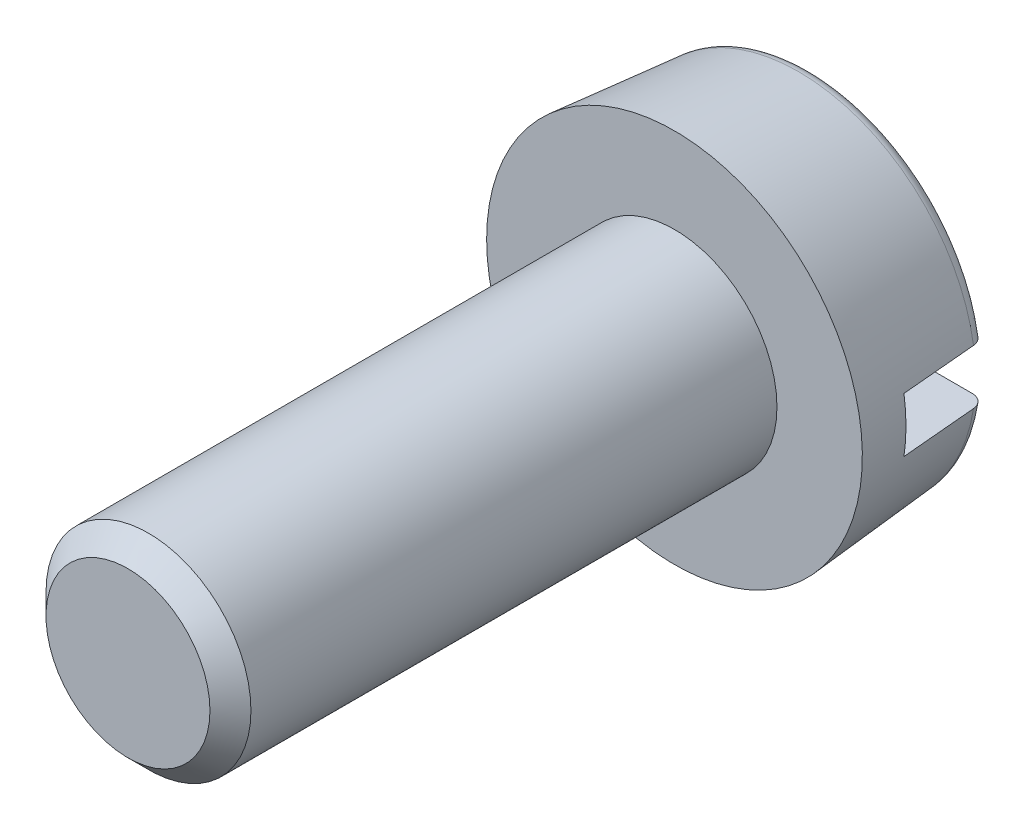
ISO-10303-21;
HEADER;
FILE_DESCRIPTION(('STEP AP214'),'2;1');
FILE_NAME('part.step','',(''),(''),'','','');
FILE_SCHEMA(('AUTOMOTIVE_DESIGN { 1 0 10303 214 1 1 1 1 }'));
ENDSEC;
DATA;
#1=APPLICATION_CONTEXT('core data for automotive mechanical design processes');
#2=APPLICATION_PROTOCOL_DEFINITION('international standard','automotive_design',2000,#1);
#3=PRODUCT_CONTEXT('',#1,'mechanical');
#4=PRODUCT('Part','Part','',(#3));
#5=PRODUCT_RELATED_PRODUCT_CATEGORY('part','',(#4));
#6=PRODUCT_DEFINITION_FORMATION('','',#4);
#7=PRODUCT_DEFINITION_CONTEXT('part definition',#1,'design');
#8=PRODUCT_DEFINITION('design','',#6,#7);
#9=PRODUCT_DEFINITION_SHAPE('','',#8);
#10=(LENGTH_UNIT() NAMED_UNIT(*) SI_UNIT(.MILLI.,.METRE.));
#11=(NAMED_UNIT(*) PLANE_ANGLE_UNIT() SI_UNIT($,.RADIAN.));
#12=(NAMED_UNIT(*) SI_UNIT($,.STERADIAN.) SOLID_ANGLE_UNIT());
#13=UNCERTAINTY_MEASURE_WITH_UNIT(LENGTH_MEASURE(1.E-05),#10,'distance_accuracy_value','');
#14=(GEOMETRIC_REPRESENTATION_CONTEXT(3) GLOBAL_UNCERTAINTY_ASSIGNED_CONTEXT((#13)) GLOBAL_UNIT_ASSIGNED_CONTEXT((#10,
#11,#12)) REPRESENTATION_CONTEXT('',''));
#15=CARTESIAN_POINT('',(0.,0.,0.));
#16=DIRECTION('',(0.,0.,1.));
#17=DIRECTION('',(1.,0.,0.));
#18=AXIS2_PLACEMENT_3D('',#15,#16,#17);
#19=CARTESIAN_POINT('',(0.,0.,-2.));
#20=DIRECTION('',(0.,0.,1.));
#21=DIRECTION('',(1.,0.,0.));
#22=AXIS2_PLACEMENT_3D('',#19,#20,#21);
#23=PLANE('',#22);
#24=DIRECTION('',(1.,0.,0.));
#25=VECTOR('',#24,1.);
#26=CARTESIAN_POINT('',(-2.75000000000005,-0.399999999999965,-2.));
#27=LINE('',#26,#25);
#28=CARTESIAN_POINT('',(-2.35807100389422,-0.399999999999972,-2.));
#29=VERTEX_POINT('',#28);
#30=CARTESIAN_POINT('',(2.35807100389412,-0.39999999999998,-1.99999999999997));
#31=VERTEX_POINT('',#30);
#32=EDGE_CURVE('E206',#29,#31,#27,.T.);
#33=ORIENTED_EDGE('',*,*,#32,.T.);
#34=CARTESIAN_POINT('',(0.,0.,-2.));
#35=DIRECTION('',(0.,0.,-1.));
#36=DIRECTION('',(-1.,0.,0.));
#37=AXIS2_PLACEMENT_3D('',#34,#35,#36);
#38=CIRCLE('',#37,2.39175643814467);
#39=EDGE_CURVE('E116',#31,#29,#38,.T.);
#40=ORIENTED_EDGE('',*,*,#39,.T.);
#41=EDGE_LOOP('',(#33,#40));
#42=FACE_BOUND('',#41,.T.);
#43=ADVANCED_FACE('F36',(#42),#23,.F.);
#44=DIRECTION('',(-1.,0.,0.));
#45=VECTOR('',#44,1.);
#46=CARTESIAN_POINT('',(-2.75,0.400000000000036,-2.));
#47=LINE('',#46,#45);
#48=CARTESIAN_POINT('',(2.35807100389417,0.400000000000018,-1.99999999999997));
#49=VERTEX_POINT('',#48);
#50=CARTESIAN_POINT('',(-2.35807100389417,0.400000000000029,-2.));
#51=VERTEX_POINT('',#50);
#52=EDGE_CURVE('E101',#49,#51,#47,.T.);
#53=ORIENTED_EDGE('',*,*,#52,.T.);
#54=EDGE_CURVE('E113',#51,#49,#38,.T.);
#55=ORIENTED_EDGE('',*,*,#54,.T.);
#56=EDGE_LOOP('',(#53,#55));
#57=FACE_BOUND('',#56,.T.);
#58=ADVANCED_FACE('F147',(#57),#23,.F.);
#59=CARTESIAN_POINT('',(0.,0.,-1.8));
#60=DIRECTION('',(0.,0.,-1.));
#61=DIRECTION('',(-1.,0.,0.));
#62=AXIS2_PLACEMENT_3D('',#59,#60,#61);
#63=TOROIDAL_SURFACE('',#62,2.39175643814467,0.2);
#64=CARTESIAN_POINT('',(-2.4605600417854,-0.399999999999949,-1.62743732282769));
#65=CARTESIAN_POINT('',(-2.47035713771362,-0.40000000000003,-1.6330918956269));
#66=CARTESIAN_POINT('',(-2.47967120968412,-0.400000000000017,-1.63958058222681));
#67=CARTESIAN_POINT('',(-2.49708617580804,-0.399999999999955,-1.65401697585564));
#68=CARTESIAN_POINT('',(-2.5051873842648,-0.399999999999906,-1.66196430369759));
#69=CARTESIAN_POINT('',(-2.51994054140107,-0.399999999999919,-1.67911855993578));
#70=CARTESIAN_POINT('',(-2.52659136348955,-0.399999999999983,-1.68832645851095));
#71=CARTESIAN_POINT('',(-2.53823475569537,-0.39999999999999,-1.70773274727025));
#72=CARTESIAN_POINT('',(-2.54322794237564,-0.399999999999934,-1.71793076734715));
#73=CARTESIAN_POINT('',(-2.55137056882459,-0.399999999999933,-1.73893734663612));
#74=CARTESIAN_POINT('',(-2.5545354800085,-0.399999999999986,-1.7497399079006));
#75=CARTESIAN_POINT('',(-2.55899152309467,-0.399999999999987,-1.77172702826334));
#76=CARTESIAN_POINT('',(-2.56028235923898,-0.399999999999935,-1.78291164737122));
#77=CARTESIAN_POINT('',(-2.56094692370975,-0.399999999999935,-1.80525009863336));
#78=CARTESIAN_POINT('',(-2.56033550381027,-0.399999999999988,-1.81640349220421));
#79=CARTESIAN_POINT('',(-2.55724668819747,-0.399999999999985,-1.83844701181155));
#80=CARTESIAN_POINT('',(-2.55476962692714,-0.399999999999931,-1.84933718467304));
#81=CARTESIAN_POINT('',(-2.54811803088498,-0.399999999999936,-1.87025531071061));
#82=CARTESIAN_POINT('',(-2.54399201458239,-0.399999999999992,-1.88029873415848));
#83=CARTESIAN_POINT('',(-2.53416340972972,-0.399999999999981,-1.89958227885853));
#84=CARTESIAN_POINT('',(-2.52846069409218,-0.399999999999914,-1.90882233527758));
#85=CARTESIAN_POINT('',(-2.51532195694859,-0.399999999999908,-1.92668639740783));
#86=CARTESIAN_POINT('',(-2.50781480613999,-0.399999999999975,-1.93525817422743));
#87=CARTESIAN_POINT('',(-2.49146359340207,-0.399999999999998,-1.95101498291771));
#88=CARTESIAN_POINT('',(-2.48261933414434,-0.399999999999953,-1.95819980974751));
#89=CARTESIAN_POINT('',(-2.46385856904251,-0.399999999999945,-1.97098405380469));
#90=CARTESIAN_POINT('',(-2.45394264626074,-0.399999999999982,-1.9765843272022));
#91=CARTESIAN_POINT('',(-2.43331831418858,-0.39999999999999,-1.98605791164413));
#92=CARTESIAN_POINT('',(-2.42260990186942,-0.399999999999961,-1.98993121608799));
#93=CARTESIAN_POINT('',(-2.40060009323848,-0.399999999999957,-1.99587983027349));
#94=CARTESIAN_POINT('',(-2.38929418448381,-0.399999999999982,-1.99793844318606));
#95=CARTESIAN_POINT('',(-2.36649726575477,-0.399999999999989,-2.00014639157024));
#96=CARTESIAN_POINT('',(-2.35500624501966,-0.399999999999971,-2.00029561564318));
#97=CARTESIAN_POINT('',(-2.33205956114725,-0.399999999999969,-1.99867602832688));
#98=CARTESIAN_POINT('',(-2.3206050698602,-0.399999999999986,-1.99689056381176));
#99=CARTESIAN_POINT('',(-2.29815743333205,-0.399999999999985,-1.991423603746));
#100=CARTESIAN_POINT('',(-2.28716429851481,-0.399999999999968,-1.98774206538056));
#101=CARTESIAN_POINT('',(-2.26594729101626,-0.399999999999965,-1.97857791165463));
#102=CARTESIAN_POINT('',(-2.25572391519221,-0.39999999999998,-1.97309414505155));
#103=CARTESIAN_POINT('',(-2.2363537488912,-0.39999999999999,-1.96047345136072));
#104=CARTESIAN_POINT('',(-2.22720691749828,-0.399999999999986,-1.95333658713245));
#105=CARTESIAN_POINT('',(-2.21034118493017,-0.399999999999985,-1.93767625834849));
#106=CARTESIAN_POINT('',(-2.20261024787554,-0.399999999999988,-1.92916576187784));
#107=CARTESIAN_POINT('',(-2.18871351593381,-0.399999999999982,-1.91095027538821));
#108=CARTESIAN_POINT('',(-2.18254759560358,-0.399999999999972,-1.90124538119822));
#109=CARTESIAN_POINT('',(-2.1720570221821,-0.399999999999971,-1.88107521593229));
#110=CARTESIAN_POINT('',(-2.16770567375064,-0.39999999999998,-1.8706238295452));
#111=CARTESIAN_POINT('',(-2.1608480670028,-0.39999999999999,-1.84913260903685));
#112=CARTESIAN_POINT('',(-2.15834160412076,-0.39999999999999,-1.83809284030257));
#113=CARTESIAN_POINT('',(-2.15527626227133,-0.399999999999988,-1.81590555227183));
#114=CARTESIAN_POINT('',(-2.15469036795997,-0.399999999999985,-1.80476175885527));
#115=CARTESIAN_POINT('',(-2.15540871532183,-0.399999999999985,-1.78253485647783));
#116=CARTESIAN_POINT('',(-2.15671299585114,-0.399999999999987,-1.77145174876917));
#117=CARTESIAN_POINT('',(-2.16115872402039,-0.39999999999999,-1.74972083301123));
#118=CARTESIAN_POINT('',(-2.16429062237401,-0.399999999999991,-1.73907106788335));
#119=CARTESIAN_POINT('',(-2.17228616758964,-0.399999999999979,-1.71844530878055));
#120=CARTESIAN_POINT('',(-2.17714955248401,-0.399999999999966,-1.70846921315334));
#121=CARTESIAN_POINT('',(-2.18849754138882,-0.399999999999967,-1.68940045861752));
#122=CARTESIAN_POINT('',(-2.19499228163309,-0.39999999999998,-1.68031383615372));
#123=CARTESIAN_POINT('',(-2.20939691243697,-0.39999999999999,-1.66333658924761));
#124=CARTESIAN_POINT('',(-2.21730736300274,-0.399999999999986,-1.65544644037886));
#125=CARTESIAN_POINT('',(-2.23443758836596,-0.399999999999985,-1.64097145988085));
#126=CARTESIAN_POINT('',(-2.24367438000381,-0.399999999999987,-1.63440678222681));
#127=CARTESIAN_POINT('',(-2.26310409568545,-0.399999999999984,-1.62288608988969));
#128=CARTESIAN_POINT('',(-2.27329719167918,-0.399999999999978,-1.61793036522444));
#129=CARTESIAN_POINT('',(-2.28383355011748,-0.399999999999961,-1.61386077429795));
#130=B_SPLINE_CURVE_WITH_KNOTS('',3,(#64,#65,#66,#67,#68,#69,#70,#71,#72,#73,#74,#75,#76,#77,
#78,#79,#80,#81,#82,#83,#84,#85,#86,#87,#88,#89,#90,#91,#92,#93,#94,#95,#96,#97,#98,#99,#100,
#101,#102,#103,#104,#105,#106,#107,#108,#109,#110,#111,#112,#113,#114,#115,#116,#117,#118,#119,
#120,#121,#122,#123,#124,#125,#126,#127,#128,#129),.UNSPECIFIED.,.F.,.F.,(4,2,2,2,2,2,2,2,2,2,2,
2,2,2,2,2,2,2,2,2,2,2,2,2,2,2,2,2,2,2,2,2,4),(0.,0.0338945792603668,0.0677803597663861,
0.101692368115313,0.135591748612002,0.16919989357111,0.202813341837617,0.236165015100389,
0.269510711019386,0.301940042779759,0.334371989219773,0.368390051962458,0.402413139947973,
0.436417809228246,0.470422608475106,0.504737112164696,0.539053617841926,0.573667871705665,
0.608282907220178,0.642920097538091,0.67755597098368,0.711882165999222,0.746205608746155,
0.780004581271521,0.813799805514872,0.847117567780255,0.8804360149645,0.913581912852898,
0.946722798016732,0.980074926842273,1.01344027789711,1.04728001683905,1.08112585209714),.UNSPECIFIED.);
#131=CARTESIAN_POINT('',(-2.55993301623102,-0.399999999999935,-1.81743114854954));
#132=VERTEX_POINT('',#131);
#133=EDGE_CURVE('E58',#29,#132,#130,.F.);
#134=ORIENTED_EDGE('',*,*,#133,.F.);
#135=ORIENTED_EDGE('',*,*,#39,.F.);
#136=CARTESIAN_POINT('',(2.26463348026235,-0.399999999999998,-1.62245170009983));
#137=CARTESIAN_POINT('',(2.25450054073576,-0.399999999999964,-1.62761569853838));
#138=CARTESIAN_POINT('',(2.24480752991891,-0.399999999999962,-1.63364077839552));
#139=CARTESIAN_POINT('',(2.22655983263298,-0.399999999999974,-1.64721950340534));
#140=CARTESIAN_POINT('',(2.21800507386964,-0.399999999999988,-1.65477305140292));
#141=CARTESIAN_POINT('',(2.20228447263954,-0.399999999999986,-1.67122264462359));
#142=CARTESIAN_POINT('',(2.19511978892486,-0.399999999999969,-1.6801197989709));
#143=CARTESIAN_POINT('',(2.18240904844835,-0.399999999999967,-1.69899889603276));
#144=CARTESIAN_POINT('',(2.17686229372644,-0.399999999999982,-1.70898036842422));
#145=CARTESIAN_POINT('',(2.16761264111978,-0.399999999999979,-1.72962714987186));
#146=CARTESIAN_POINT('',(2.16388939296722,-0.399999999999962,-1.74028333883805));
#147=CARTESIAN_POINT('',(2.1583106336773,-0.399999999999974,-1.76207632529258));
#148=CARTESIAN_POINT('',(2.15645538985861,-0.400000000000003,-1.77321319132994));
#149=CARTESIAN_POINT('',(2.15468535271504,-0.400000000000003,-1.7954934978136));
#150=CARTESIAN_POINT('',(2.15474560121551,-0.399999999999974,-1.80663496347926));
#151=CARTESIAN_POINT('',(2.15674287492518,-0.399999999999962,-1.82874600777539));
#152=CARTESIAN_POINT('',(2.15867941968291,-0.399999999999979,-1.83971562967813));
#153=CARTESIAN_POINT('',(2.16422713339622,-0.399999999999981,-1.86064578372031));
#154=CARTESIAN_POINT('',(2.1677515972529,-0.399999999999968,-1.87062942323595));
#155=CARTESIAN_POINT('',(2.17634210171244,-0.399999999999968,-1.88991007303383));
#156=CARTESIAN_POINT('',(2.18140828581154,-0.399999999999981,-1.89920701930167));
#157=CARTESIAN_POINT('',(2.19339026564783,-0.399999999999983,-1.91756626472196));
#158=CARTESIAN_POINT('',(2.20041839508227,-0.399999999999968,-1.92655545075783));
#159=CARTESIAN_POINT('',(2.21588967531857,-0.399999999999968,-1.94322154599182));
#160=CARTESIAN_POINT('',(2.22433316391766,-0.399999999999982,-1.9508981410343));
#161=CARTESIAN_POINT('',(2.24237838377758,-0.399999999999982,-1.9647264118528));
#162=CARTESIAN_POINT('',(2.25197933702395,-0.399999999999967,-1.97087910354964));
#163=CARTESIAN_POINT('',(2.2720686068349,-0.399999999999968,-1.98150489939313));
#164=CARTESIAN_POINT('',(2.28255691427447,-0.399999999999983,-1.98597802080885));
#165=CARTESIAN_POINT('',(2.30424234507614,-0.399999999999984,-1.99316733226731));
#166=CARTESIAN_POINT('',(2.31544577512196,-0.399999999999969,-1.99586450380929));
#167=CARTESIAN_POINT('',(2.3381457020927,-0.399999999999966,-1.99935479377092));
#168=CARTESIAN_POINT('',(2.34964221483809,-0.399999999999978,-2.0001478091842));
#169=CARTESIAN_POINT('',(2.37268954119824,-0.399999999999983,-1.99980564272042));
#170=CARTESIAN_POINT('',(2.38424015252537,-0.399999999999975,-1.99865658434914));
#171=CARTESIAN_POINT('',(2.40698369055455,-0.399999999999959,-1.99443117611345));
#172=CARTESIAN_POINT('',(2.41817661653888,-0.399999999999951,-1.99135482238203));
#173=CARTESIAN_POINT('',(2.43985624751774,-0.399999999999954,-1.98336386476074));
#174=CARTESIAN_POINT('',(2.45034456018346,-0.399999999999966,-1.97845362571821));
#175=CARTESIAN_POINT('',(2.47033664112808,-0.399999999999967,-1.9669251727542));
#176=CARTESIAN_POINT('',(2.47984045676069,-0.399999999999956,-1.96030704103481));
#177=CARTESIAN_POINT('',(2.49749194128105,-0.399999999999952,-1.94561808698038));
#178=CARTESIAN_POINT('',(2.50565202217529,-0.399999999999959,-1.93756218332159));
#179=CARTESIAN_POINT('',(2.52048285687226,-0.399999999999974,-1.92017934561431));
#180=CARTESIAN_POINT('',(2.52715370435612,-0.399999999999981,-1.91085249157522));
#181=CARTESIAN_POINT('',(2.53872804707251,-0.399999999999976,-1.89131867048411));
#182=CARTESIAN_POINT('',(2.54365271331896,-0.399999999999964,-1.88112424670727));
#183=CARTESIAN_POINT('',(2.55170010500725,-0.399999999999969,-1.86004764571285));
#184=CARTESIAN_POINT('',(2.55482298300976,-0.399999999999986,-1.84916552681025));
#185=CARTESIAN_POINT('',(2.55914820369927,-0.399999999999981,-1.82714318153544));
#186=CARTESIAN_POINT('',(2.56037005684573,-0.39999999999996,-1.81600678382111));
#187=CARTESIAN_POINT('',(2.5609176592444,-0.399999999999973,-1.79368689282811));
#188=CARTESIAN_POINT('',(2.56024334737568,-0.400000000000008,-1.78250339804292));
#189=CARTESIAN_POINT('',(2.55702614182444,-0.400000000000008,-1.76045880563839));
#190=CARTESIAN_POINT('',(2.55449142375162,-0.399999999999975,-1.74959651306949));
#191=CARTESIAN_POINT('',(2.54763978977162,-0.399999999999958,-1.72845177415931));
#192=CARTESIAN_POINT('',(2.54332318309075,-0.399999999999976,-1.71816922756149));
#193=CARTESIAN_POINT('',(2.53302184315005,-0.399999999999981,-1.6984409604814));
#194=CARTESIAN_POINT('',(2.52703252235397,-0.399999999999969,-1.68899763687536));
#195=CARTESIAN_POINT('',(2.51356522448802,-0.399999999999964,-1.67123531207252));
#196=CARTESIAN_POINT('',(2.50608671893236,-0.399999999999971,-1.66291671178515));
#197=CARTESIAN_POINT('',(2.48978467837259,-0.399999999999976,-1.64756522962556));
#198=CARTESIAN_POINT('',(2.48094983304356,-0.399999999999973,-1.64054436909157));
#199=CARTESIAN_POINT('',(2.46224022282623,-0.39999999999996,-1.62805472149628));
#200=CARTESIAN_POINT('',(2.45236515665189,-0.39999999999995,-1.62258638580699));
#201=CARTESIAN_POINT('',(2.4421006394498,-0.399999999999935,-1.6179837926665));
#202=B_SPLINE_CURVE_WITH_KNOTS('',3,(#136,#137,#138,#139,#140,#141,#142,#143,#144,#145,#146,
#147,#148,#149,#150,#151,#152,#153,#154,#155,#156,#157,#158,#159,#160,#161,#162,#163,#164,#165,
#166,#167,#168,#169,#170,#171,#172,#173,#174,#175,#176,#177,#178,#179,#180,#181,#182,#183,#184,
#185,#186,#187,#188,#189,#190,#191,#192,#193,#194,#195,#196,#197,#198,#199,#200,#201),
.UNSPECIFIED.,.F.,.F.,(4,2,2,2,2,2,2,2,2,2,2,2,2,2,2,2,2,2,2,2,2,2,2,2,2,2,2,2,2,2,2,2,4),(0.,
0.0340784350610085,0.0681547046506876,0.102259258957657,0.136349079032534,0.170049259623656,
0.203754262156428,0.237020282856044,0.270277787583964,0.3019056947509,0.333536546598873,
0.367601525247717,0.401674645633489,0.435724989422832,0.469774983102543,0.504183928420165,
0.538594735066813,0.573252454397657,0.607910243267623,0.642486063119363,0.677060219122457,
0.711294528107364,0.745526682954943,0.779328337966712,0.813127130511072,0.846576698333585,
0.880027344381173,0.913331864107987,0.946630606645665,0.980021585617147,1.01342443565354,
1.04712269569688,1.08083074296668),.UNSPECIFIED.);
#203=CARTESIAN_POINT('',(2.55993301623092,-0.400000000000008,-1.81743114854951));
#204=VERTEX_POINT('',#203);
#205=EDGE_CURVE('E134',#204,#31,#202,.F.);
#206=ORIENTED_EDGE('',*,*,#205,.F.);
#207=CARTESIAN_POINT('',(0.,0.,-1.81743114854954));
#208=DIRECTION('',(0.,0.,-1.));
#209=DIRECTION('',(-1.,0.,0.));
#210=AXIS2_PLACEMENT_3D('',#207,#208,#209);
#211=CIRCLE('',#210,2.59099537776302);
#212=EDGE_CURVE('E125',#204,#132,#211,.T.);
#213=ORIENTED_EDGE('',*,*,#212,.T.);
#214=EDGE_LOOP('',(#134,#135,#206,#213));
#215=FACE_BOUND('',#214,.T.);
#216=ADVANCED_FACE('F142',(#215),#63,.T.);
#217=CARTESIAN_POINT('',(-2.46056004178539,0.40000000000005,-1.62743732282769));
#218=CARTESIAN_POINT('',(-2.47035713771363,0.399999999999968,-1.63309189562688));
#219=CARTESIAN_POINT('',(-2.47967120968413,0.399999999999981,-1.63958058222679));
#220=CARTESIAN_POINT('',(-2.49708617580803,0.400000000000044,-1.65401697585563));
#221=CARTESIAN_POINT('',(-2.50518738426478,0.400000000000095,-1.66196430369759));
#222=CARTESIAN_POINT('',(-2.51994054140106,0.400000000000081,-1.67911855993577));
#223=CARTESIAN_POINT('',(-2.52659136348956,0.400000000000016,-1.68832645851093));
#224=CARTESIAN_POINT('',(-2.53823475569536,0.400000000000009,-1.70773274727024));
#225=CARTESIAN_POINT('',(-2.54322794237559,0.400000000000066,-1.71793076734715));
#226=CARTESIAN_POINT('',(-2.55137056882455,0.400000000000068,-1.73893734663612));
#227=CARTESIAN_POINT('',(-2.55453548000851,0.400000000000013,-1.74973990790059));
#228=CARTESIAN_POINT('',(-2.55899152309468,0.400000000000012,-1.77172702826333));
#229=CARTESIAN_POINT('',(-2.56028235923894,0.400000000000066,-1.78291164737122));
#230=CARTESIAN_POINT('',(-2.56094692370971,0.400000000000065,-1.80525009863337));
#231=CARTESIAN_POINT('',(-2.56033550381028,0.400000000000011,-1.81640349220422));
#232=CARTESIAN_POINT('',(-2.55724668819748,0.400000000000013,-1.83844701181155));
#233=CARTESIAN_POINT('',(-2.55476962692711,0.400000000000069,-1.84933718467304));
#234=CARTESIAN_POINT('',(-2.54811803088494,0.400000000000065,-1.87025531071062));
#235=CARTESIAN_POINT('',(-2.54399201458239,0.400000000000007,-1.8802987341585));
#236=CARTESIAN_POINT('',(-2.53416340972972,0.400000000000018,-1.89958227885855));
#237=CARTESIAN_POINT('',(-2.52846069409215,0.400000000000086,-1.90882233527758));
#238=CARTESIAN_POINT('',(-2.51532195694855,0.400000000000093,-1.92668639740784));
#239=CARTESIAN_POINT('',(-2.50781480613998,0.400000000000024,-1.93525817422746));
#240=CARTESIAN_POINT('',(-2.49146359340206,0.400000000000001,-1.95101498291773));
#241=CARTESIAN_POINT('',(-2.4826193341443,0.400000000000046,-1.95819980974751));
#242=CARTESIAN_POINT('',(-2.46385856904246,0.400000000000054,-1.97098405380469));
#243=CARTESIAN_POINT('',(-2.45394264626071,0.400000000000016,-1.97658432720222));
#244=CARTESIAN_POINT('',(-2.43331831418855,0.400000000000009,-1.98605791164416));
#245=CARTESIAN_POINT('',(-2.42260990186938,0.400000000000039,-1.989931216088));
#246=CARTESIAN_POINT('',(-2.40060009323843,0.400000000000043,-1.99587983027349));
#247=CARTESIAN_POINT('',(-2.38929418448376,0.400000000000016,-1.99793844318607));
#248=CARTESIAN_POINT('',(-2.36649726575472,0.40000000000001,-2.00014639157025));
#249=CARTESIAN_POINT('',(-2.35500624501961,0.400000000000029,-2.00029561564318));
#250=CARTESIAN_POINT('',(-2.3320595611472,0.400000000000032,-1.99867602832687));
#251=CARTESIAN_POINT('',(-2.32060506986015,0.400000000000013,-1.99689056381174));
#252=CARTESIAN_POINT('',(-2.29815743333201,0.400000000000013,-1.99142360374599));
#253=CARTESIAN_POINT('',(-2.28716429851476,0.400000000000031,-1.98774206538056));
#254=CARTESIAN_POINT('',(-2.26594729101621,0.400000000000034,-1.97857791165463));
#255=CARTESIAN_POINT('',(-2.25572391519219,0.400000000000018,-1.97309414505152));
#256=CARTESIAN_POINT('',(-2.23635374889117,0.400000000000009,-1.96047345136069));
#257=CARTESIAN_POINT('',(-2.22720691749823,0.400000000000015,-1.95333658713245));
#258=CARTESIAN_POINT('',(-2.21034118493014,0.400000000000015,-1.93767625834849));
#259=CARTESIAN_POINT('',(-2.20261024787554,0.40000000000001,-1.92916576187782));
#260=CARTESIAN_POINT('',(-2.1887135159338,0.400000000000017,-1.91095027538818));
#261=CARTESIAN_POINT('',(-2.18254759560354,0.400000000000029,-1.90124538119821));
#262=CARTESIAN_POINT('',(-2.17205702218207,0.400000000000029,-1.88107521593229));
#263=CARTESIAN_POINT('',(-2.16770567375065,0.400000000000018,-1.87062382954518));
#264=CARTESIAN_POINT('',(-2.16084806700281,0.400000000000009,-1.84913260903683));
#265=CARTESIAN_POINT('',(-2.15834160412072,0.40000000000001,-1.83809284030256));
#266=CARTESIAN_POINT('',(-2.15527626227129,0.400000000000013,-1.81590555227184));
#267=CARTESIAN_POINT('',(-2.15469036795999,0.400000000000014,-1.80476175885527));
#268=CARTESIAN_POINT('',(-2.15540871532185,0.400000000000014,-1.78253485647783));
#269=CARTESIAN_POINT('',(-2.1567129958511,0.400000000000013,-1.77145174876917));
#270=CARTESIAN_POINT('',(-2.16115872402035,0.40000000000001,-1.74972083301123));
#271=CARTESIAN_POINT('',(-2.16429062237401,0.400000000000008,-1.73907106788337));
#272=CARTESIAN_POINT('',(-2.17228616758966,0.40000000000002,-1.71844530878056));
#273=CARTESIAN_POINT('',(-2.177149552484,0.400000000000034,-1.70846921315334));
#274=CARTESIAN_POINT('',(-2.1884975413888,0.400000000000034,-1.68940045861752));
#275=CARTESIAN_POINT('',(-2.19499228163309,0.400000000000019,-1.68031383615374));
#276=CARTESIAN_POINT('',(-2.20939691243698,0.400000000000009,-1.66333658924762));
#277=CARTESIAN_POINT('',(-2.21730736300273,0.400000000000014,-1.65544644037886));
#278=CARTESIAN_POINT('',(-2.23443758836595,0.400000000000016,-1.64097145988085));
#279=CARTESIAN_POINT('',(-2.24367438000379,0.400000000000013,-1.63440678222682));
#280=CARTESIAN_POINT('',(-2.26310409568544,0.400000000000014,-1.6228860898897));
#281=CARTESIAN_POINT('',(-2.27329719167918,0.400000000000019,-1.61793036522446));
#282=CARTESIAN_POINT('',(-2.28383355011747,0.400000000000037,-1.61386077429795));
#283=B_SPLINE_CURVE_WITH_KNOTS('',3,(#217,#218,#219,#220,#221,#222,#223,#224,#225,#226,#227,
#228,#229,#230,#231,#232,#233,#234,#235,#236,#237,#238,#239,#240,#241,#242,#243,#244,#245,#246,
#247,#248,#249,#250,#251,#252,#253,#254,#255,#256,#257,#258,#259,#260,#261,#262,#263,#264,#265,
#266,#267,#268,#269,#270,#271,#272,#273,#274,#275,#276,#277,#278,#279,#280,#281,#282),
.UNSPECIFIED.,.F.,.F.,(4,2,2,2,2,2,2,2,2,2,2,2,2,2,2,2,2,2,2,2,2,2,2,2,2,2,2,2,2,2,2,2,4),(0.,
0.0338945792603676,0.0677803597663838,0.101692368115307,0.135591748611993,0.169199893571106,
0.202813341837617,0.236165015100394,0.269510711019395,0.301940042779773,0.334371989219791,
0.368390051962479,0.402413139947995,0.436417809228276,0.470422608475145,0.504737112164735,
0.539053617841965,0.573667871705703,0.608282907220216,0.64292009753812,0.677555970983703,
0.71188216599924,0.746205608746168,0.78000458127153,0.813799805514877,0.847117567780255,
0.880436014964496,0.913581912852893,0.946722798016729,0.980074926842271,1.0134402778971,
1.04728001683904,1.08112585209713),.UNSPECIFIED.);
#284=CARTESIAN_POINT('',(-2.55993301623095,0.400000000000065,-1.81743114854954));
#285=VERTEX_POINT('',#284);
#286=EDGE_CURVE('E159',#285,#51,#283,.T.);
#287=ORIENTED_EDGE('',*,*,#286,.F.);
#288=CARTESIAN_POINT('',(2.55993301623099,0.399999999999992,-1.81743114854951));
#289=VERTEX_POINT('',#288);
#290=EDGE_CURVE('E121',#285,#289,#211,.T.);
#291=ORIENTED_EDGE('',*,*,#290,.T.);
#292=CARTESIAN_POINT('',(2.26463348026236,0.400000000000001,-1.62245170009983));
#293=CARTESIAN_POINT('',(2.25450054073577,0.400000000000034,-1.62761569853838));
#294=CARTESIAN_POINT('',(2.24480752991892,0.400000000000036,-1.63364077839552));
#295=CARTESIAN_POINT('',(2.22655983263299,0.400000000000025,-1.64721950340534));
#296=CARTESIAN_POINT('',(2.21800507386965,0.400000000000012,-1.65477305140293));
#297=CARTESIAN_POINT('',(2.20228447263955,0.400000000000014,-1.67122264462359));
#298=CARTESIAN_POINT('',(2.19511978892487,0.40000000000003,-1.68011979897089));
#299=CARTESIAN_POINT('',(2.18240904844838,0.400000000000031,-1.69899889603276));
#300=CARTESIAN_POINT('',(2.17686229372648,0.400000000000017,-1.70898036842422));
#301=CARTESIAN_POINT('',(2.16761264111982,0.40000000000002,-1.72962714987186));
#302=CARTESIAN_POINT('',(2.16388939296723,0.400000000000037,-1.74028333883804));
#303=CARTESIAN_POINT('',(2.15831063367731,0.400000000000024,-1.76207632529257));
#304=CARTESIAN_POINT('',(2.15645538985865,0.399999999999996,-1.77321319132994));
#305=CARTESIAN_POINT('',(2.15468535271508,0.399999999999996,-1.7954934978136));
#306=CARTESIAN_POINT('',(2.15474560121551,0.400000000000025,-1.80663496347926));
#307=CARTESIAN_POINT('',(2.15674287492519,0.400000000000036,-1.82874600777539));
#308=CARTESIAN_POINT('',(2.15867941968295,0.40000000000002,-1.83971562967813));
#309=CARTESIAN_POINT('',(2.16422713339626,0.400000000000017,-1.86064578372032));
#310=CARTESIAN_POINT('',(2.16775159725291,0.400000000000031,-1.87062942323597));
#311=CARTESIAN_POINT('',(2.17634210171245,0.400000000000031,-1.88991007303384));
#312=CARTESIAN_POINT('',(2.18140828581158,0.400000000000017,-1.89920701930167));
#313=CARTESIAN_POINT('',(2.19339026564788,0.400000000000016,-1.91756626472196));
#314=CARTESIAN_POINT('',(2.2004183950823,0.40000000000003,-1.92655545075785));
#315=CARTESIAN_POINT('',(2.21588967531859,0.400000000000031,-1.94322154599184));
#316=CARTESIAN_POINT('',(2.22433316391769,0.400000000000018,-1.9508981410343));
#317=CARTESIAN_POINT('',(2.24237838377762,0.400000000000018,-1.9647264118528));
#318=CARTESIAN_POINT('',(2.25197933702399,0.400000000000031,-1.97087910354965));
#319=CARTESIAN_POINT('',(2.27206860683494,0.400000000000031,-1.98150489939315));
#320=CARTESIAN_POINT('',(2.28255691427452,0.400000000000017,-1.98597802080886));
#321=CARTESIAN_POINT('',(2.30424234507619,0.400000000000017,-1.9931673322673));
#322=CARTESIAN_POINT('',(2.31544577512201,0.40000000000003,-1.99586450380929));
#323=CARTESIAN_POINT('',(2.33814570209275,0.400000000000032,-1.99935479377093));
#324=CARTESIAN_POINT('',(2.34964221483814,0.400000000000021,-2.00014780918421));
#325=CARTESIAN_POINT('',(2.3726895411983,0.400000000000016,-1.99980564272042));
#326=CARTESIAN_POINT('',(2.38424015252542,0.400000000000023,-1.99865658434913));
#327=CARTESIAN_POINT('',(2.4069836905546,0.40000000000004,-1.99443117611345));
#328=CARTESIAN_POINT('',(2.41817661653894,0.40000000000005,-1.99135482238203));
#329=CARTESIAN_POINT('',(2.43985624751779,0.400000000000046,-1.98336386476074));
#330=CARTESIAN_POINT('',(2.4503445601835,0.400000000000032,-1.97845362571819));
#331=CARTESIAN_POINT('',(2.47033664112812,0.400000000000031,-1.96692517275418));
#332=CARTESIAN_POINT('',(2.47984045676074,0.400000000000044,-1.96030704103481));
#333=CARTESIAN_POINT('',(2.49749194128109,0.400000000000048,-1.94561808698038));
#334=CARTESIAN_POINT('',(2.50565202217531,0.40000000000004,-1.93756218332157));
#335=CARTESIAN_POINT('',(2.52048285687228,0.400000000000024,-1.9201793456143));
#336=CARTESIAN_POINT('',(2.52715370435617,0.400000000000018,-1.91085249157522));
#337=CARTESIAN_POINT('',(2.53872804707254,0.400000000000023,-1.89131867048411));
#338=CARTESIAN_POINT('',(2.54365271331897,0.400000000000034,-1.88112424670726));
#339=CARTESIAN_POINT('',(2.55170010500726,0.40000000000003,-1.86004764571284));
#340=CARTESIAN_POINT('',(2.5548229830098,0.400000000000014,-1.84916552681025));
#341=CARTESIAN_POINT('',(2.55914820369931,0.400000000000019,-1.82714318153544));
#342=CARTESIAN_POINT('',(2.56037005684574,0.400000000000039,-1.81600678382111));
#343=CARTESIAN_POINT('',(2.56091765924441,0.400000000000026,-1.79368689282811));
#344=CARTESIAN_POINT('',(2.56024334737571,0.399999999999993,-1.78250339804292));
#345=CARTESIAN_POINT('',(2.55702614182448,0.399999999999992,-1.76045880563839));
#346=CARTESIAN_POINT('',(2.55449142375163,0.400000000000024,-1.7495965130695));
#347=CARTESIAN_POINT('',(2.54763978977163,0.40000000000004,-1.72845177415932));
#348=CARTESIAN_POINT('',(2.54332318309079,0.400000000000024,-1.71816922756149));
#349=CARTESIAN_POINT('',(2.5330218431501,0.400000000000019,-1.6984409604814));
#350=CARTESIAN_POINT('',(2.52703252235399,0.40000000000003,-1.68899763687537));
#351=CARTESIAN_POINT('',(2.51356522448802,0.400000000000034,-1.67123531207253));
#352=CARTESIAN_POINT('',(2.50608671893237,0.400000000000028,-1.66291671178516));
#353=CARTESIAN_POINT('',(2.4897846783726,0.400000000000023,-1.64756522962555));
#354=CARTESIAN_POINT('',(2.48094983304358,0.400000000000025,-1.64054436909157));
#355=CARTESIAN_POINT('',(2.46224022282623,0.400000000000038,-1.62805472149628));
#356=CARTESIAN_POINT('',(2.4523651566519,0.400000000000049,-1.622586385807));
#357=CARTESIAN_POINT('',(2.44210063944981,0.400000000000065,-1.6179837926665));
#358=B_SPLINE_CURVE_WITH_KNOTS('',3,(#292,#293,#294,#295,#296,#297,#298,#299,#300,#301,#302,
#303,#304,#305,#306,#307,#308,#309,#310,#311,#312,#313,#314,#315,#316,#317,#318,#319,#320,#321,
#322,#323,#324,#325,#326,#327,#328,#329,#330,#331,#332,#333,#334,#335,#336,#337,#338,#339,#340,
#341,#342,#343,#344,#345,#346,#347,#348,#349,#350,#351,#352,#353,#354,#355,#356,#357),
.UNSPECIFIED.,.F.,.F.,(4,2,2,2,2,2,2,2,2,2,2,2,2,2,2,2,2,2,2,2,2,2,2,2,2,2,2,2,2,2,2,2,4),(0.,
0.0340784350610116,0.0681547046506878,0.102259258957649,0.13634907903252,0.170049259623645,
0.203754262156419,0.237020282856037,0.270277787583961,0.301905694750899,0.333536546598875,
0.367601525247719,0.401674645633492,0.435724989422843,0.469774983102564,0.504183928420185,
0.538594735066832,0.573252454397675,0.60791024326764,0.642486063119374,0.677060219122462,
0.711294528107367,0.745526682954944,0.77932833796671,0.813127130511067,0.846576698333577,
0.880027344381162,0.913331864107973,0.946630606645648,0.980021585617135,1.01342443565354,
1.04712269569687,1.08083074296668),.UNSPECIFIED.);
#359=EDGE_CURVE('E153',#49,#289,#358,.T.);
#360=ORIENTED_EDGE('',*,*,#359,.F.);
#361=ORIENTED_EDGE('',*,*,#54,.F.);
#362=EDGE_LOOP('',(#287,#291,#360,#361));
#363=FACE_BOUND('',#362,.T.);
#364=ADVANCED_FACE('F146',(#363),#63,.T.);
#365=CARTESIAN_POINT('',(0.,0.,0.));
#366=DIRECTION('',(0.,0.,1.));
#367=DIRECTION('',(1.,0.,0.));
#368=AXIS2_PLACEMENT_3D('',#365,#366,#367);
#369=CONICAL_SURFACE('',#368,2.75,0.0872664625997168);
#370=CARTESIAN_POINT('',(0.,0.,0.));
#371=DIRECTION('',(0.,0.,-1.));
#372=DIRECTION('',(-1.,0.,0.));
#373=AXIS2_PLACEMENT_3D('',#370,#371,#372);
#374=CIRCLE('',#373,2.75);
#375=CARTESIAN_POINT('',(-2.75,0.,0.));
#376=VERTEX_POINT('',#375);
#377=EDGE_CURVE('E126',#376,#376,#374,.T.);
#378=ORIENTED_EDGE('',*,*,#377,.T.);
#379=EDGE_LOOP('',(#378));
#380=FACE_BOUND('',#379,.T.);
#381=CARTESIAN_POINT('',(-2.17665154772391,-0.399999999999992,-6.1367941769867));
#382=CARTESIAN_POINT('',(-2.29688458486512,-0.399999999999883,-4.78501127268335));
#383=CARTESIAN_POINT('',(-2.41682603752157,-0.399999999999895,-3.43320249226895));
#384=CARTESIAN_POINT('',(-2.55941857675346,-0.399999999999941,-1.82327092364093));
#385=CARTESIAN_POINT('',(-2.58227138200541,-0.399999999999949,-1.5651660063847));
#386=CARTESIAN_POINT('',(-2.74761802963445,-0.400000000000012,0.302879201153455));
#387=CARTESIAN_POINT('',(-2.88984427565487,-0.400000000000078,1.91284318721372));
#388=CARTESIAN_POINT('',(-3.03193476862783,-0.399999999999999,3.52281911459643));
#389=B_SPLINE_CURVE_WITH_KNOTS('',3,(#381,#382,#383,#384,#385,#386,#387,#388),.UNSPECIFIED.,.F.,
.F.,(4,2,2,4),(0.,4.07135801908916,4.84870195240369,9.69740384490694),.UNSPECIFIED.);
#390=CARTESIAN_POINT('',(-2.65883794840632,-0.399999999999963,-0.700000000000006));
#391=VERTEX_POINT('',#390);
#392=EDGE_CURVE('E86',#132,#391,#389,.T.);
#393=ORIENTED_EDGE('',*,*,#392,.F.);
#394=ORIENTED_EDGE('',*,*,#212,.F.);
#395=CARTESIAN_POINT('',(3.03193476862786,-0.399999999999999,3.52281911459644));
#396=CARTESIAN_POINT('',(2.96089605445599,-0.399999999999962,2.71783055674442));
#397=CARTESIAN_POINT('',(2.88981709739849,-0.399999999999959,1.91284554745653));
#398=CARTESIAN_POINT('',(2.74755308776784,-0.399999999999972,0.302884928336918));
#399=CARTESIAN_POINT('',(2.6763680351978,-0.399999999999988,-0.502090681495082));
#400=CARTESIAN_POINT('',(2.53386621970369,-0.39999999999999,-2.11203025710067));
#401=CARTESIAN_POINT('',(2.46254945677789,-0.399999999999975,-2.91699422287411));
#402=CARTESIAN_POINT('',(2.31974175238758,-0.399999999999959,-4.52690672629519));
#403=CARTESIAN_POINT('',(2.24825081091792,-0.399999999999957,-5.33185526394238));
#404=CARTESIAN_POINT('',(2.17665154772384,-0.399999999999984,-6.13679417698667));
#405=B_SPLINE_CURVE_WITH_KNOTS('',3,(#395,#396,#397,#398,#399,#400,#401,#402,#403,#404),
.UNSPECIFIED.,.F.,.F.,(4,2,2,2,4),(0.,2.42435098703179,4.84870190303198,7.27305285081885,
9.6974038702348),.UNSPECIFIED.);
#406=CARTESIAN_POINT('',(2.65883794840632,-0.399999999999982,-0.699999999999972));
#407=VERTEX_POINT('',#406);
#408=EDGE_CURVE('E106',#407,#204,#405,.T.);
#409=ORIENTED_EDGE('',*,*,#408,.F.);
#410=CARTESIAN_POINT('',(0.,0.,-0.700000000000006));
#411=DIRECTION('',(0.,0.,1.));
#412=DIRECTION('',(1.,0.,0.));
#413=AXIS2_PLACEMENT_3D('',#410,#411,#412);
#414=CIRCLE('',#413,2.68875793553185);
#415=CARTESIAN_POINT('',(2.65883794840632,0.400000000000017,-0.699999999999972));
#416=VERTEX_POINT('',#415);
#417=EDGE_CURVE('E100',#407,#416,#414,.T.);
#418=ORIENTED_EDGE('',*,*,#417,.T.);
#419=CARTESIAN_POINT('',(2.17665154772387,0.400000000000017,-6.13679417698667));
#420=CARTESIAN_POINT('',(2.29688458486498,0.400000000000024,-4.78501127268333));
#421=CARTESIAN_POINT('',(2.41682603752146,0.400000000000021,-3.43320249226891));
#422=CARTESIAN_POINT('',(2.55941857675342,0.400000000000014,-1.8232709236409));
#423=CARTESIAN_POINT('',(2.58227138200539,0.400000000000013,-1.56516600638467));
#424=CARTESIAN_POINT('',(2.74761802963451,0.400000000000004,0.302879201153469));
#425=CARTESIAN_POINT('',(2.88984427565501,0.399999999999996,1.91284318721369));
#426=CARTESIAN_POINT('',(3.03193476862784,0.400000000000001,3.52281911459643));
#427=B_SPLINE_CURVE_WITH_KNOTS('',3,(#419,#420,#421,#422,#423,#424,#425,#426),.UNSPECIFIED.,.F.,
.F.,(4,2,2,4),(0.,4.07135801908916,4.84870195240369,9.69740384490691),.UNSPECIFIED.);
#428=EDGE_CURVE('E109',#289,#416,#427,.T.);
#429=ORIENTED_EDGE('',*,*,#428,.F.);
#430=ORIENTED_EDGE('',*,*,#290,.F.);
#431=CARTESIAN_POINT('',(-3.03193476862786,0.399999999999999,3.52281911459644));
#432=CARTESIAN_POINT('',(-2.96089605445597,0.399999999999986,2.71783055674442));
#433=CARTESIAN_POINT('',(-2.88981709739848,0.399999999999997,1.91284554745652));
#434=CARTESIAN_POINT('',(-2.74755308776784,0.400000000000025,0.302884928336895));
#435=CARTESIAN_POINT('',(-2.67636803519781,0.400000000000043,-0.502090681495112));
#436=CARTESIAN_POINT('',(-2.5338662197037,0.400000000000043,-2.11203025710071));
#437=CARTESIAN_POINT('',(-2.46254945677788,0.400000000000026,-2.91699422287415));
#438=CARTESIAN_POINT('',(-2.31974175238757,0.4,-4.52690672629522));
#439=CARTESIAN_POINT('',(-2.24825081091792,0.399999999999991,-5.33185526394241));
#440=CARTESIAN_POINT('',(-2.17665154772387,0.400000000000008,-6.1367941769867));
#441=B_SPLINE_CURVE_WITH_KNOTS('',3,(#431,#432,#433,#434,#435,#436,#437,#438,#439,#440),
.UNSPECIFIED.,.F.,.F.,(4,2,2,2,4),(0.,2.42435098703181,4.84870190303201,7.27305285081888,
9.69740387023483),.UNSPECIFIED.);
#442=CARTESIAN_POINT('',(-2.65883794840632,0.400000000000037,-0.700000000000006));
#443=VERTEX_POINT('',#442);
#444=EDGE_CURVE('E95',#443,#285,#441,.T.);
#445=ORIENTED_EDGE('',*,*,#444,.F.);
#446=EDGE_CURVE('E98',#443,#391,#414,.T.);
#447=ORIENTED_EDGE('',*,*,#446,.T.);
#448=EDGE_LOOP('',(#393,#394,#409,#418,#429,#430,#445,#447));
#449=FACE_BOUND('',#448,.T.);
#450=ADVANCED_FACE('F104',(#380,#449),#369,.T.);
#451=CARTESIAN_POINT('',(0.,0.,0.));
#452=DIRECTION('',(0.,0.,-1.));
#453=DIRECTION('',(-1.,0.,0.));
#454=AXIS2_PLACEMENT_3D('',#451,#452,#453);
#455=PLANE('',#454);
#456=CARTESIAN_POINT('',(0.,0.,0.));
#457=DIRECTION('',(0.,0.,1.));
#458=DIRECTION('',(1.,0.,0.));
#459=AXIS2_PLACEMENT_3D('',#456,#457,#458);
#460=CIRCLE('',#459,1.5);
#461=CARTESIAN_POINT('',(1.5,0.,0.));
#462=VERTEX_POINT('',#461);
#463=EDGE_CURVE('E208',#462,#462,#460,.T.);
#464=ORIENTED_EDGE('',*,*,#463,.F.);
#465=EDGE_LOOP('',(#464));
#466=FACE_BOUND('',#465,.T.);
#467=ORIENTED_EDGE('',*,*,#377,.F.);
#468=EDGE_LOOP('',(#467));
#469=FACE_BOUND('',#468,.T.);
#470=ADVANCED_FACE('F221',(#466,#469),#455,.F.);
#471=CARTESIAN_POINT('',(-2.75,-0.399999999999987,-0.700000000000006));
#472=DIRECTION('',(0.,1.,0.));
#473=DIRECTION('',(0.,0.,1.));
#474=AXIS2_PLACEMENT_3D('',#471,#472,#473);
#475=PLANE('',#474);
#476=ORIENTED_EDGE('',*,*,#133,.T.);
#477=ORIENTED_EDGE('',*,*,#392,.T.);
#478=DIRECTION('',(1.,0.,0.));
#479=VECTOR('',#478,1.);
#480=CARTESIAN_POINT('',(-2.75,-0.399999999999987,-0.700000000000006));
#481=LINE('',#480,#479);
#482=EDGE_CURVE('E89',#391,#407,#481,.T.);
#483=ORIENTED_EDGE('',*,*,#482,.T.);
#484=ORIENTED_EDGE('',*,*,#408,.T.);
#485=ORIENTED_EDGE('',*,*,#205,.T.);
#486=ORIENTED_EDGE('',*,*,#32,.F.);
#487=EDGE_LOOP('',(#476,#477,#483,#484,#485,#486));
#488=FACE_BOUND('',#487,.T.);
#489=ADVANCED_FACE('F88',(#488),#475,.T.);
#490=CARTESIAN_POINT('',(-2.75,0.400000000000011,-0.700000000000006));
#491=DIRECTION('',(0.,-1.,0.));
#492=DIRECTION('',(0.,0.,-1.));
#493=AXIS2_PLACEMENT_3D('',#490,#491,#492);
#494=PLANE('',#493);
#495=ORIENTED_EDGE('',*,*,#286,.T.);
#496=ORIENTED_EDGE('',*,*,#52,.F.);
#497=ORIENTED_EDGE('',*,*,#359,.T.);
#498=ORIENTED_EDGE('',*,*,#428,.T.);
#499=DIRECTION('',(-1.,0.,0.));
#500=VECTOR('',#499,1.);
#501=CARTESIAN_POINT('',(-2.75,0.400000000000011,-0.700000000000006));
#502=LINE('',#501,#500);
#503=EDGE_CURVE('E50',#416,#443,#502,.T.);
#504=ORIENTED_EDGE('',*,*,#503,.T.);
#505=ORIENTED_EDGE('',*,*,#444,.T.);
#506=EDGE_LOOP('',(#495,#496,#497,#498,#504,#505));
#507=FACE_BOUND('',#506,.T.);
#508=ADVANCED_FACE('F163',(#507),#494,.T.);
#509=CARTESIAN_POINT('',(-2.75,-0.399999999999987,-0.700000000000006));
#510=DIRECTION('',(0.,0.,1.));
#511=DIRECTION('',(1.,0.,0.));
#512=AXIS2_PLACEMENT_3D('',#509,#510,#511);
#513=PLANE('',#512);
#514=ORIENTED_EDGE('',*,*,#503,.F.);
#515=ORIENTED_EDGE('',*,*,#417,.F.);
#516=ORIENTED_EDGE('',*,*,#482,.F.);
#517=ORIENTED_EDGE('',*,*,#446,.F.);
#518=EDGE_LOOP('',(#514,#515,#516,#517));
#519=FACE_BOUND('',#518,.T.);
#520=ADVANCED_FACE('F97',(#519),#513,.F.);
#521=CARTESIAN_POINT('',(0.,0.,8.));
#522=DIRECTION('',(0.,0.,1.));
#523=DIRECTION('',(1.,0.,0.));
#524=AXIS2_PLACEMENT_3D('',#521,#522,#523);
#525=PLANE('',#524);
#526=CARTESIAN_POINT('',(0.,0.,8.));
#527=DIRECTION('',(0.,0.,1.));
#528=DIRECTION('',(1.,0.,0.));
#529=AXIS2_PLACEMENT_3D('',#526,#527,#528);
#530=CIRCLE('',#529,1.19999999999999);
#531=CARTESIAN_POINT('',(1.2,0.,8.));
#532=VERTEX_POINT('',#531);
#533=EDGE_CURVE('E43',#532,#532,#530,.T.);
#534=ORIENTED_EDGE('',*,*,#533,.T.);
#535=EDGE_LOOP('',(#534));
#536=FACE_BOUND('',#535,.T.);
#537=ADVANCED_FACE('F187',(#536),#525,.T.);
#538=CARTESIAN_POINT('',(0.,0.,0.));
#539=DIRECTION('',(0.,0.,1.));
#540=DIRECTION('',(1.,0.,0.));
#541=AXIS2_PLACEMENT_3D('',#538,#539,#540);
#542=CYLINDRICAL_SURFACE('',#541,1.5);
#543=CARTESIAN_POINT('',(0.,0.,7.69999999999997));
#544=DIRECTION('',(0.,0.,1.));
#545=DIRECTION('',(1.,0.,0.));
#546=AXIS2_PLACEMENT_3D('',#543,#544,#545);
#547=CIRCLE('',#546,1.5);
#548=CARTESIAN_POINT('',(1.5,0.,7.69999999999997));
#549=VERTEX_POINT('',#548);
#550=EDGE_CURVE('E11',#549,#549,#547,.F.);
#551=ORIENTED_EDGE('',*,*,#550,.T.);
#552=EDGE_LOOP('',(#551));
#553=FACE_BOUND('',#552,.T.);
#554=ORIENTED_EDGE('',*,*,#463,.T.);
#555=EDGE_LOOP('',(#554));
#556=FACE_BOUND('',#555,.T.);
#557=ADVANCED_FACE('F191',(#553,#556),#542,.T.);
#558=CARTESIAN_POINT('',(0.,0.,8.));
#559=DIRECTION('',(0.,0.,-1.));
#560=DIRECTION('',(-1.,0.,0.));
#561=AXIS2_PLACEMENT_3D('',#558,#559,#560);
#562=CONICAL_SURFACE('',#561,1.2,0.785398163397454);
#563=ORIENTED_EDGE('',*,*,#550,.F.);
#564=EDGE_LOOP('',(#563));
#565=FACE_BOUND('',#564,.T.);
#566=ORIENTED_EDGE('',*,*,#533,.F.);
#567=EDGE_LOOP('',(#566));
#568=FACE_BOUND('',#567,.T.);
#569=ADVANCED_FACE('F189',(#565,#568),#562,.T.);
#570=CLOSED_SHELL('',(#43,#58,#216,#364,#450,#470,#489,#508,#520,#537,#557,#569));
#571=MANIFOLD_SOLID_BREP('B2',#570);
#572=ADVANCED_BREP_SHAPE_REPRESENTATION('',(#18,#571),#14);
#573=SHAPE_DEFINITION_REPRESENTATION(#9,#572);
ENDSEC;
END-ISO-10303-21;
